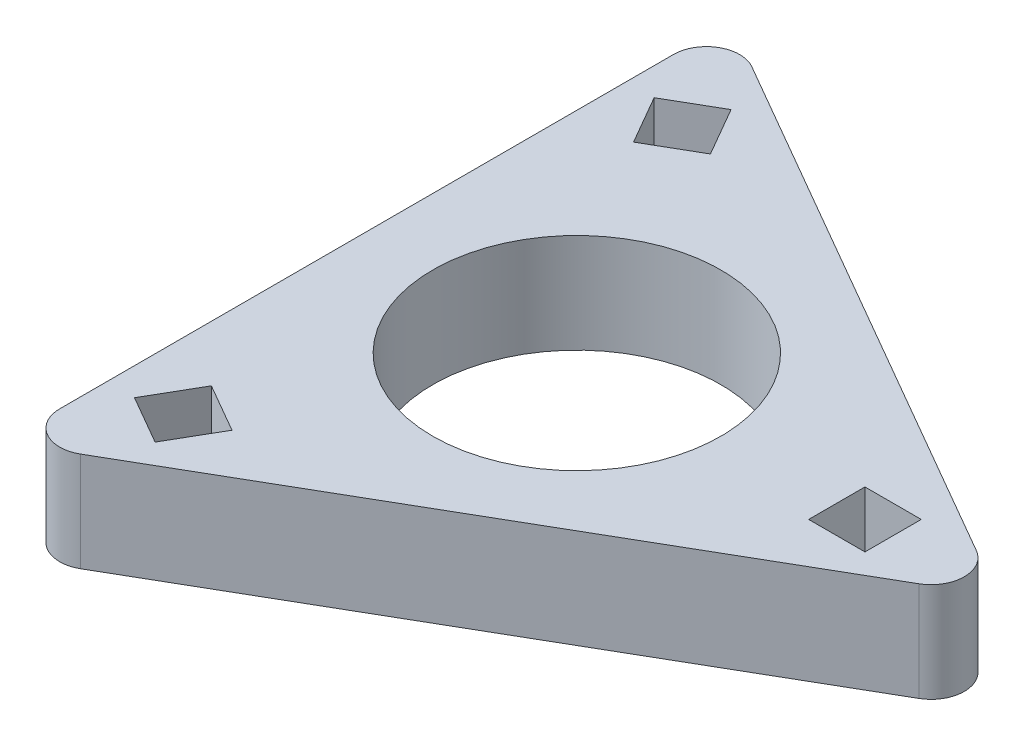
ISO-10303-21;
HEADER;
FILE_DESCRIPTION(('STEP AP214'),'2;1');
FILE_NAME('part.step','',(''),(''),'','','');
FILE_SCHEMA(('AUTOMOTIVE_DESIGN { 1 0 10303 214 1 1 1 1 }'));
ENDSEC;
DATA;
#1=APPLICATION_CONTEXT('core data for automotive mechanical design processes');
#2=APPLICATION_PROTOCOL_DEFINITION('international standard','automotive_design',2000,#1);
#3=PRODUCT_CONTEXT('',#1,'mechanical');
#4=PRODUCT('Part','Part','',(#3));
#5=PRODUCT_RELATED_PRODUCT_CATEGORY('part','',(#4));
#6=PRODUCT_DEFINITION_FORMATION('','',#4);
#7=PRODUCT_DEFINITION_CONTEXT('part definition',#1,'design');
#8=PRODUCT_DEFINITION('design','',#6,#7);
#9=PRODUCT_DEFINITION_SHAPE('','',#8);
#10=(LENGTH_UNIT() NAMED_UNIT(*) SI_UNIT(.MILLI.,.METRE.));
#11=(NAMED_UNIT(*) PLANE_ANGLE_UNIT() SI_UNIT($,.RADIAN.));
#12=(NAMED_UNIT(*) SI_UNIT($,.STERADIAN.) SOLID_ANGLE_UNIT());
#13=UNCERTAINTY_MEASURE_WITH_UNIT(LENGTH_MEASURE(1.E-05),#10,'distance_accuracy_value','');
#14=(GEOMETRIC_REPRESENTATION_CONTEXT(3) GLOBAL_UNCERTAINTY_ASSIGNED_CONTEXT((#13)) GLOBAL_UNIT_ASSIGNED_CONTEXT((#10,
#11,#12)) REPRESENTATION_CONTEXT('',''));
#15=CARTESIAN_POINT('',(0.,0.,0.));
#16=DIRECTION('',(0.,0.,1.));
#17=DIRECTION('',(1.,0.,0.));
#18=AXIS2_PLACEMENT_3D('',#15,#16,#17);
#19=CARTESIAN_POINT('',(0.,15.,0.));
#20=DIRECTION('',(0.,1.,0.));
#21=DIRECTION('',(0.,0.,1.));
#22=AXIS2_PLACEMENT_3D('',#19,#20,#21);
#23=PLANE('',#22);
#24=DIRECTION('',(-0.86602540378445,0.,-0.49999999999998));
#25=VECTOR('',#24,1.);
#26=CARTESIAN_POINT('',(184.942144258614,15.,-95.4106104839048));
#27=LINE('',#26,#25);
#28=CARTESIAN_POINT('',(177.442144258614,15.,-99.7407375028269));
#29=VERTEX_POINT('',#28);
#30=CARTESIAN_POINT('',(97.1793498423255,15.,-146.08048346498));
#31=VERTEX_POINT('',#30);
#32=EDGE_CURVE('E276',#29,#31,#27,.T.);
#33=ORIENTED_EDGE('',*,*,#32,.T.);
#34=CARTESIAN_POINT('',(94.6793498423255,15.,-141.750356446058));
#35=DIRECTION('',(0.,1.,0.));
#36=DIRECTION('',(0.,0.,1.));
#37=AXIS2_PLACEMENT_3D('',#34,#35,#36);
#38=CIRCLE('',#37,5.);
#39=CARTESIAN_POINT('',(89.6793498423255,15.,-141.750356446058));
#40=VERTEX_POINT('',#39);
#41=EDGE_CURVE('E307',#31,#40,#38,.T.);
#42=ORIENTED_EDGE('',*,*,#41,.T.);
#43=DIRECTION('',(0.,0.,1.));
#44=VECTOR('',#43,1.);
#45=CARTESIAN_POINT('',(89.6793498423255,15.,-150.410610483902));
#46=LINE('',#45,#44);
#47=CARTESIAN_POINT('',(89.6793498423264,15.,-49.0708645217476));
#48=VERTEX_POINT('',#47);
#49=EDGE_CURVE('E280',#40,#48,#46,.T.);
#50=ORIENTED_EDGE('',*,*,#49,.T.);
#51=CARTESIAN_POINT('',(94.6793498423264,15.,-49.0708645217476));
#52=DIRECTION('',(0.,1.,0.));
#53=DIRECTION('',(0.,0.,1.));
#54=AXIS2_PLACEMENT_3D('',#51,#52,#53);
#55=CIRCLE('',#54,5.);
#56=CARTESIAN_POINT('',(97.1793498423265,15.,-44.7407375028255));
#57=VERTEX_POINT('',#56);
#58=EDGE_CURVE('E59',#48,#57,#55,.T.);
#59=ORIENTED_EDGE('',*,*,#58,.T.);
#60=DIRECTION('',(0.86602540378443,0.,-0.500000000000016));
#61=VECTOR('',#60,1.);
#62=CARTESIAN_POINT('',(89.6793498423265,15.,-40.4106104839031));
#63=LINE('',#62,#61);
#64=CARTESIAN_POINT('',(177.442144258614,15.,-91.0804834649825));
#65=VERTEX_POINT('',#64);
#66=EDGE_CURVE('E274',#57,#65,#63,.T.);
#67=ORIENTED_EDGE('',*,*,#66,.T.);
#68=CARTESIAN_POINT('',(174.942144258614,15.,-95.4106104839046));
#69=DIRECTION('',(0.,1.,0.));
#70=DIRECTION('',(0.,0.,1.));
#71=AXIS2_PLACEMENT_3D('',#68,#69,#70);
#72=CIRCLE('',#71,5.);
#73=EDGE_CURVE('E305',#65,#29,#72,.T.);
#74=ORIENTED_EDGE('',*,*,#73,.T.);
#75=EDGE_LOOP('',(#33,#42,#50,#59,#67,#74));
#76=FACE_BOUND('',#75,.T.);
#77=CARTESIAN_POINT('',(121.433614647755,15.,-95.4106104839035));
#78=DIRECTION('',(0.,1.,0.));
#79=DIRECTION('',(0.,0.,1.));
#80=AXIS2_PLACEMENT_3D('',#77,#78,#79);
#81=CIRCLE('',#80,21.7542648054293);
#82=CARTESIAN_POINT('',(121.433614647755,15.,-73.6563456784742));
#83=VERTEX_POINT('',#82);
#84=EDGE_CURVE('E268',#83,#83,#81,.T.);
#85=ORIENTED_EDGE('',*,*,#84,.F.);
#86=EDGE_LOOP('',(#85));
#87=FACE_BOUND('',#86,.T.);
#88=DIRECTION('',(-0.866025403784443,0.,-0.499999999999992));
#89=VECTOR('',#88,1.);
#90=CARTESIAN_POINT('',(105.484957808406,15.,-59.2867265256794));
#91=LINE('',#90,#89);
#92=CARTESIAN_POINT('',(105.484957808406,15.,-59.2867265256794));
#93=VERTEX_POINT('',#92);
#94=CARTESIAN_POINT('',(98.1237418762381,15.,-63.5367265256793));
#95=VERTEX_POINT('',#94);
#96=EDGE_CURVE('E239',#93,#95,#91,.T.);
#97=ORIENTED_EDGE('',*,*,#96,.F.);
#98=DIRECTION('',(0.499999999999994,0.,-0.866025403784442));
#99=VECTOR('',#98,1.);
#100=CARTESIAN_POINT('',(101.234957808406,15.,-51.9255105935116));
#101=LINE('',#100,#99);
#102=CARTESIAN_POINT('',(101.234957808406,15.,-51.9255105935116));
#103=VERTEX_POINT('',#102);
#104=EDGE_CURVE('E237',#103,#93,#101,.T.);
#105=ORIENTED_EDGE('',*,*,#104,.F.);
#106=DIRECTION('',(0.866025403784443,0.,0.499999999999993));
#107=VECTOR('',#106,1.);
#108=CARTESIAN_POINT('',(93.8737418762381,15.,-56.1755105935115));
#109=LINE('',#108,#107);
#110=CARTESIAN_POINT('',(93.8737418762381,15.,-56.1755105935115));
#111=VERTEX_POINT('',#110);
#112=EDGE_CURVE('E245',#111,#103,#109,.T.);
#113=ORIENTED_EDGE('',*,*,#112,.F.);
#114=DIRECTION('',(-0.499999999999992,0.,0.866025403784443));
#115=VECTOR('',#114,1.);
#116=CARTESIAN_POINT('',(98.1237418762381,15.,-63.5367265256793));
#117=LINE('',#116,#115);
#118=EDGE_CURVE('E242',#95,#111,#117,.T.);
#119=ORIENTED_EDGE('',*,*,#118,.F.);
#120=EDGE_LOOP('',(#97,#105,#113,#119));
#121=FACE_BOUND('',#120,.T.);
#122=DIRECTION('',(-1.,0.,0.));
#123=VECTOR('',#122,1.);
#124=CARTESIAN_POINT('',(169.192144258612,15.,-99.6606104839158));
#125=LINE('',#124,#123);
#126=CARTESIAN_POINT('',(169.192144258612,15.,-99.6606104839158));
#127=VERTEX_POINT('',#126);
#128=CARTESIAN_POINT('',(160.692144258612,15.,-99.6606104839158));
#129=VERTEX_POINT('',#128);
#130=EDGE_CURVE('E208',#127,#129,#125,.T.);
#131=ORIENTED_EDGE('',*,*,#130,.F.);
#132=DIRECTION('',(0.,0.,-1.));
#133=VECTOR('',#132,1.);
#134=CARTESIAN_POINT('',(169.192144258613,15.,-91.1606104839167));
#135=LINE('',#134,#133);
#136=CARTESIAN_POINT('',(169.192144258613,15.,-91.1606104839167));
#137=VERTEX_POINT('',#136);
#138=EDGE_CURVE('E206',#137,#127,#135,.T.);
#139=ORIENTED_EDGE('',*,*,#138,.F.);
#140=DIRECTION('',(1.,0.,0.));
#141=VECTOR('',#140,1.);
#142=CARTESIAN_POINT('',(160.692144258613,15.,-91.1606104839168));
#143=LINE('',#142,#141);
#144=CARTESIAN_POINT('',(160.692144258613,15.,-91.1606104839168));
#145=VERTEX_POINT('',#144);
#146=EDGE_CURVE('E214',#145,#137,#143,.T.);
#147=ORIENTED_EDGE('',*,*,#146,.F.);
#148=DIRECTION('',(0.,0.,1.));
#149=VECTOR('',#148,1.);
#150=CARTESIAN_POINT('',(160.692144258612,15.,-99.6606104839158));
#151=LINE('',#150,#149);
#152=EDGE_CURVE('E211',#129,#145,#151,.T.);
#153=ORIENTED_EDGE('',*,*,#152,.F.);
#154=EDGE_LOOP('',(#131,#139,#147,#153));
#155=FACE_BOUND('',#154,.T.);
#156=DIRECTION('',(-0.500000000000009,0.,-0.866025403784433));
#157=VECTOR('',#156,1.);
#158=CARTESIAN_POINT('',(105.484957808413,15.,-131.53449444213));
#159=LINE('',#158,#157);
#160=CARTESIAN_POINT('',(105.484957808413,15.,-131.53449444213));
#161=VERTEX_POINT('',#160);
#162=CARTESIAN_POINT('',(101.234957808413,15.,-138.895710374298));
#163=VERTEX_POINT('',#162);
#164=EDGE_CURVE('E175',#161,#163,#159,.T.);
#165=ORIENTED_EDGE('',*,*,#164,.F.);
#166=DIRECTION('',(0.866025403784434,0.,-0.500000000000008));
#167=VECTOR('',#166,1.);
#168=CARTESIAN_POINT('',(98.1237418762454,15.,-127.28449444213));
#169=LINE('',#168,#167);
#170=CARTESIAN_POINT('',(98.1237418762454,15.,-127.28449444213));
#171=VERTEX_POINT('',#170);
#172=EDGE_CURVE('E165',#171,#161,#169,.T.);
#173=ORIENTED_EDGE('',*,*,#172,.F.);
#174=DIRECTION('',(0.500000000000009,0.,0.866025403784433));
#175=VECTOR('',#174,1.);
#176=CARTESIAN_POINT('',(93.8737418762453,15.,-134.645710374298));
#177=LINE('',#176,#175);
#178=CARTESIAN_POINT('',(93.8737418762453,15.,-134.645710374298));
#179=VERTEX_POINT('',#178);
#180=EDGE_CURVE('E190',#179,#171,#177,.T.);
#181=ORIENTED_EDGE('',*,*,#180,.F.);
#182=DIRECTION('',(-0.866025403784434,0.,0.500000000000008));
#183=VECTOR('',#182,1.);
#184=CARTESIAN_POINT('',(101.234957808413,15.,-138.895710374298));
#185=LINE('',#184,#183);
#186=EDGE_CURVE('E188',#163,#179,#185,.T.);
#187=ORIENTED_EDGE('',*,*,#186,.F.);
#188=EDGE_LOOP('',(#165,#173,#181,#187));
#189=FACE_BOUND('',#188,.T.);
#190=ADVANCED_FACE('F39',(#76,#87,#121,#155,#189),#23,.T.);
#191=CARTESIAN_POINT('',(0.,0.,0.));
#192=DIRECTION('',(0.,1.,0.));
#193=DIRECTION('',(0.,0.,1.));
#194=AXIS2_PLACEMENT_3D('',#191,#192,#193);
#195=PLANE('',#194);
#196=DIRECTION('',(0.,0.,-1.));
#197=VECTOR('',#196,1.);
#198=CARTESIAN_POINT('',(169.192144258613,0.,-91.1606104839167));
#199=LINE('',#198,#197);
#200=CARTESIAN_POINT('',(169.192144258613,0.,-91.1606104839167));
#201=VERTEX_POINT('',#200);
#202=CARTESIAN_POINT('',(169.192144258612,0.,-99.6606104839158));
#203=VERTEX_POINT('',#202);
#204=EDGE_CURVE('E183',#201,#203,#199,.T.);
#205=ORIENTED_EDGE('',*,*,#204,.T.);
#206=DIRECTION('',(-1.,0.,0.));
#207=VECTOR('',#206,1.);
#208=CARTESIAN_POINT('',(169.192144258612,0.,-99.6606104839158));
#209=LINE('',#208,#207);
#210=CARTESIAN_POINT('',(160.692144258612,0.,-99.6606104839158));
#211=VERTEX_POINT('',#210);
#212=EDGE_CURVE('E219',#203,#211,#209,.T.);
#213=ORIENTED_EDGE('',*,*,#212,.T.);
#214=DIRECTION('',(0.,0.,1.));
#215=VECTOR('',#214,1.);
#216=CARTESIAN_POINT('',(160.692144258612,0.,-99.6606104839158));
#217=LINE('',#216,#215);
#218=CARTESIAN_POINT('',(160.692144258613,0.,-91.1606104839168));
#219=VERTEX_POINT('',#218);
#220=EDGE_CURVE('E222',#211,#219,#217,.T.);
#221=ORIENTED_EDGE('',*,*,#220,.T.);
#222=DIRECTION('',(1.,0.,0.));
#223=VECTOR('',#222,1.);
#224=CARTESIAN_POINT('',(160.692144258613,0.,-91.1606104839168));
#225=LINE('',#224,#223);
#226=EDGE_CURVE('E209',#219,#201,#225,.T.);
#227=ORIENTED_EDGE('',*,*,#226,.T.);
#228=EDGE_LOOP('',(#205,#213,#221,#227));
#229=FACE_BOUND('',#228,.T.);
#230=CARTESIAN_POINT('',(121.433614647755,0.,-95.4106104839035));
#231=DIRECTION('',(0.,1.,0.));
#232=DIRECTION('',(0.,0.,1.));
#233=AXIS2_PLACEMENT_3D('',#230,#231,#232);
#234=CIRCLE('',#233,21.7542648054293);
#235=CARTESIAN_POINT('',(121.433614647755,0.,-73.6563456784742));
#236=VERTEX_POINT('',#235);
#237=EDGE_CURVE('E267',#236,#236,#234,.T.);
#238=ORIENTED_EDGE('',*,*,#237,.T.);
#239=EDGE_LOOP('',(#238));
#240=FACE_BOUND('',#239,.T.);
#241=DIRECTION('',(0.,0.,1.));
#242=VECTOR('',#241,1.);
#243=CARTESIAN_POINT('',(89.6793498423255,0.,-150.410610483902));
#244=LINE('',#243,#242);
#245=CARTESIAN_POINT('',(89.6793498423255,0.,-141.750356446058));
#246=VERTEX_POINT('',#245);
#247=CARTESIAN_POINT('',(89.6793498423264,0.,-49.0708645217476));
#248=VERTEX_POINT('',#247);
#249=EDGE_CURVE('E277',#246,#248,#244,.T.);
#250=ORIENTED_EDGE('',*,*,#249,.F.);
#251=CARTESIAN_POINT('',(94.6793498423255,0.,-141.750356446058));
#252=DIRECTION('',(0.,1.,0.));
#253=DIRECTION('',(0.,0.,1.));
#254=AXIS2_PLACEMENT_3D('',#251,#252,#253);
#255=CIRCLE('',#254,5.);
#256=CARTESIAN_POINT('',(97.1793498423255,0.,-146.08048346498));
#257=VERTEX_POINT('',#256);
#258=EDGE_CURVE('E297',#246,#257,#255,.F.);
#259=ORIENTED_EDGE('',*,*,#258,.T.);
#260=DIRECTION('',(-0.86602540378445,0.,-0.49999999999998));
#261=VECTOR('',#260,1.);
#262=CARTESIAN_POINT('',(184.942144258614,0.,-95.4106104839048));
#263=LINE('',#262,#261);
#264=CARTESIAN_POINT('',(177.442144258614,0.,-99.7407375028269));
#265=VERTEX_POINT('',#264);
#266=EDGE_CURVE('E284',#265,#257,#263,.T.);
#267=ORIENTED_EDGE('',*,*,#266,.F.);
#268=CARTESIAN_POINT('',(174.942144258614,0.,-95.4106104839046));
#269=DIRECTION('',(0.,1.,0.));
#270=DIRECTION('',(0.,0.,1.));
#271=AXIS2_PLACEMENT_3D('',#268,#269,#270);
#272=CIRCLE('',#271,5.);
#273=CARTESIAN_POINT('',(177.442144258614,0.,-91.0804834649825));
#274=VERTEX_POINT('',#273);
#275=EDGE_CURVE('E295',#265,#274,#272,.F.);
#276=ORIENTED_EDGE('',*,*,#275,.T.);
#277=DIRECTION('',(0.86602540378443,0.,-0.500000000000016));
#278=VECTOR('',#277,1.);
#279=CARTESIAN_POINT('',(89.6793498423265,0.,-40.4106104839031));
#280=LINE('',#279,#278);
#281=CARTESIAN_POINT('',(97.1793498423265,0.,-44.7407375028255));
#282=VERTEX_POINT('',#281);
#283=EDGE_CURVE('E271',#282,#274,#280,.T.);
#284=ORIENTED_EDGE('',*,*,#283,.F.);
#285=CARTESIAN_POINT('',(94.6793498423264,0.,-49.0708645217476));
#286=DIRECTION('',(0.,1.,0.));
#287=DIRECTION('',(0.,0.,1.));
#288=AXIS2_PLACEMENT_3D('',#285,#286,#287);
#289=CIRCLE('',#288,5.);
#290=EDGE_CURVE('E293',#282,#248,#289,.F.);
#291=ORIENTED_EDGE('',*,*,#290,.T.);
#292=EDGE_LOOP('',(#250,#259,#267,#276,#284,#291));
#293=FACE_BOUND('',#292,.T.);
#294=DIRECTION('',(0.499999999999994,0.,-0.866025403784442));
#295=VECTOR('',#294,1.);
#296=CARTESIAN_POINT('',(101.234957808406,0.,-51.9255105935116));
#297=LINE('',#296,#295);
#298=CARTESIAN_POINT('',(101.234957808406,0.,-51.9255105935116));
#299=VERTEX_POINT('',#298);
#300=CARTESIAN_POINT('',(105.484957808406,0.,-59.2867265256794));
#301=VERTEX_POINT('',#300);
#302=EDGE_CURVE('E236',#299,#301,#297,.T.);
#303=ORIENTED_EDGE('',*,*,#302,.T.);
#304=DIRECTION('',(-0.866025403784443,0.,-0.499999999999992));
#305=VECTOR('',#304,1.);
#306=CARTESIAN_POINT('',(105.484957808406,0.,-59.2867265256794));
#307=LINE('',#306,#305);
#308=CARTESIAN_POINT('',(98.1237418762381,0.,-63.5367265256793));
#309=VERTEX_POINT('',#308);
#310=EDGE_CURVE('E250',#301,#309,#307,.T.);
#311=ORIENTED_EDGE('',*,*,#310,.T.);
#312=DIRECTION('',(-0.499999999999992,0.,0.866025403784443));
#313=VECTOR('',#312,1.);
#314=CARTESIAN_POINT('',(98.1237418762381,0.,-63.5367265256793));
#315=LINE('',#314,#313);
#316=CARTESIAN_POINT('',(93.8737418762381,0.,-56.1755105935115));
#317=VERTEX_POINT('',#316);
#318=EDGE_CURVE('E253',#309,#317,#315,.T.);
#319=ORIENTED_EDGE('',*,*,#318,.T.);
#320=DIRECTION('',(0.866025403784443,0.,0.499999999999993));
#321=VECTOR('',#320,1.);
#322=CARTESIAN_POINT('',(93.8737418762381,0.,-56.1755105935115));
#323=LINE('',#322,#321);
#324=EDGE_CURVE('E240',#317,#299,#323,.T.);
#325=ORIENTED_EDGE('',*,*,#324,.T.);
#326=EDGE_LOOP('',(#303,#311,#319,#325));
#327=FACE_BOUND('',#326,.T.);
#328=DIRECTION('',(0.866025403784434,0.,-0.500000000000008));
#329=VECTOR('',#328,1.);
#330=CARTESIAN_POINT('',(98.1237418762454,0.,-127.28449444213));
#331=LINE('',#330,#329);
#332=CARTESIAN_POINT('',(98.1237418762454,0.,-127.28449444213));
#333=VERTEX_POINT('',#332);
#334=CARTESIAN_POINT('',(105.484957808413,0.,-131.53449444213));
#335=VERTEX_POINT('',#334);
#336=EDGE_CURVE('E194',#333,#335,#331,.T.);
#337=ORIENTED_EDGE('',*,*,#336,.T.);
#338=DIRECTION('',(-0.500000000000009,0.,-0.866025403784433));
#339=VECTOR('',#338,1.);
#340=CARTESIAN_POINT('',(105.484957808413,0.,-131.53449444213));
#341=LINE('',#340,#339);
#342=CARTESIAN_POINT('',(101.234957808413,0.,-138.895710374298));
#343=VERTEX_POINT('',#342);
#344=EDGE_CURVE('E182',#335,#343,#341,.T.);
#345=ORIENTED_EDGE('',*,*,#344,.T.);
#346=DIRECTION('',(-0.866025403784434,0.,0.500000000000008));
#347=VECTOR('',#346,1.);
#348=CARTESIAN_POINT('',(101.234957808413,0.,-138.895710374298));
#349=LINE('',#348,#347);
#350=CARTESIAN_POINT('',(93.8737418762453,0.,-134.645710374298));
#351=VERTEX_POINT('',#350);
#352=EDGE_CURVE('E197',#343,#351,#349,.T.);
#353=ORIENTED_EDGE('',*,*,#352,.T.);
#354=DIRECTION('',(0.500000000000009,0.,0.866025403784433));
#355=VECTOR('',#354,1.);
#356=CARTESIAN_POINT('',(93.8737418762453,0.,-134.645710374298));
#357=LINE('',#356,#355);
#358=EDGE_CURVE('E176',#351,#333,#357,.T.);
#359=ORIENTED_EDGE('',*,*,#358,.T.);
#360=EDGE_LOOP('',(#337,#345,#353,#359));
#361=FACE_BOUND('',#360,.T.);
#362=ADVANCED_FACE('F315',(#229,#240,#293,#327,#361),#195,.F.);
#363=CARTESIAN_POINT('',(89.6793498423265,15.,-40.4106104839031));
#364=DIRECTION('',(-0.500000000000016,0.,-0.86602540378443));
#365=DIRECTION('',(-0.86602540378443,0.,0.500000000000016));
#366=AXIS2_PLACEMENT_3D('',#363,#364,#365);
#367=PLANE('',#366);
#368=ORIENTED_EDGE('',*,*,#283,.T.);
#369=DIRECTION('',(0.,-1.,0.));
#370=VECTOR('',#369,1.);
#371=CARTESIAN_POINT('',(177.442144258614,15.,-91.0804834649825));
#372=LINE('',#371,#370);
#373=EDGE_CURVE('E11',#274,#65,#372,.F.);
#374=ORIENTED_EDGE('',*,*,#373,.T.);
#375=ORIENTED_EDGE('',*,*,#66,.F.);
#376=DIRECTION('',(0.,-1.,0.));
#377=VECTOR('',#376,1.);
#378=CARTESIAN_POINT('',(97.1793498423265,15.,-44.7407375028255));
#379=LINE('',#378,#377);
#380=EDGE_CURVE('E47',#57,#282,#379,.T.);
#381=ORIENTED_EDGE('',*,*,#380,.T.);
#382=EDGE_LOOP('',(#368,#374,#375,#381));
#383=FACE_BOUND('',#382,.T.);
#384=ADVANCED_FACE('F311',(#383),#367,.F.);
#385=CARTESIAN_POINT('',(184.942144258614,15.,-95.4106104839048));
#386=DIRECTION('',(-0.49999999999998,0.,0.86602540378445));
#387=DIRECTION('',(0.86602540378445,0.,0.49999999999998));
#388=AXIS2_PLACEMENT_3D('',#385,#386,#387);
#389=PLANE('',#388);
#390=ORIENTED_EDGE('',*,*,#266,.T.);
#391=DIRECTION('',(0.,-1.,0.));
#392=VECTOR('',#391,1.);
#393=CARTESIAN_POINT('',(97.1793498423255,15.,-146.08048346498));
#394=LINE('',#393,#392);
#395=EDGE_CURVE('E302',#257,#31,#394,.F.);
#396=ORIENTED_EDGE('',*,*,#395,.T.);
#397=ORIENTED_EDGE('',*,*,#32,.F.);
#398=DIRECTION('',(0.,-1.,0.));
#399=VECTOR('',#398,1.);
#400=CARTESIAN_POINT('',(177.442144258614,15.,-99.7407375028269));
#401=LINE('',#400,#399);
#402=EDGE_CURVE('E299',#29,#265,#401,.T.);
#403=ORIENTED_EDGE('',*,*,#402,.T.);
#404=EDGE_LOOP('',(#390,#396,#397,#403));
#405=FACE_BOUND('',#404,.T.);
#406=ADVANCED_FACE('F324',(#405),#389,.F.);
#407=CARTESIAN_POINT('',(89.6793498423255,15.,-150.410610483902));
#408=DIRECTION('',(1.,0.,0.));
#409=DIRECTION('',(0.,0.,-1.));
#410=AXIS2_PLACEMENT_3D('',#407,#408,#409);
#411=PLANE('',#410);
#412=ORIENTED_EDGE('',*,*,#49,.F.);
#413=DIRECTION('',(0.,-1.,0.));
#414=VECTOR('',#413,1.);
#415=CARTESIAN_POINT('',(89.6793498423255,15.,-141.750356446058));
#416=LINE('',#415,#414);
#417=EDGE_CURVE('E290',#40,#246,#416,.T.);
#418=ORIENTED_EDGE('',*,*,#417,.T.);
#419=ORIENTED_EDGE('',*,*,#249,.T.);
#420=DIRECTION('',(0.,-1.,0.));
#421=VECTOR('',#420,1.);
#422=CARTESIAN_POINT('',(89.6793498423264,15.,-49.0708645217476));
#423=LINE('',#422,#421);
#424=EDGE_CURVE('E282',#248,#48,#423,.F.);
#425=ORIENTED_EDGE('',*,*,#424,.T.);
#426=EDGE_LOOP('',(#412,#418,#419,#425));
#427=FACE_BOUND('',#426,.T.);
#428=ADVANCED_FACE('F333',(#427),#411,.F.);
#429=CARTESIAN_POINT('',(121.433614647755,15.,-95.4106104839035));
#430=DIRECTION('',(0.,-1.,0.));
#431=DIRECTION('',(0.,0.,-1.));
#432=AXIS2_PLACEMENT_3D('',#429,#430,#431);
#433=CYLINDRICAL_SURFACE('',#432,21.7542648054293);
#434=ORIENTED_EDGE('',*,*,#84,.T.);
#435=EDGE_LOOP('',(#434));
#436=FACE_BOUND('',#435,.T.);
#437=ORIENTED_EDGE('',*,*,#237,.F.);
#438=EDGE_LOOP('',(#437));
#439=FACE_BOUND('',#438,.T.);
#440=ADVANCED_FACE('F347',(#436,#439),#433,.F.);
#441=CARTESIAN_POINT('',(101.234957808406,15.,-51.9255105935116));
#442=DIRECTION('',(-0.866025403784442,0.,-0.499999999999994));
#443=DIRECTION('',(-0.499999999999994,0.,0.866025403784442));
#444=AXIS2_PLACEMENT_3D('',#441,#442,#443);
#445=PLANE('',#444);
#446=ORIENTED_EDGE('',*,*,#302,.F.);
#447=DIRECTION('',(0.,-1.,0.));
#448=VECTOR('',#447,1.);
#449=CARTESIAN_POINT('',(101.234957808406,15.,-51.9255105935116));
#450=LINE('',#449,#448);
#451=EDGE_CURVE('E247',#103,#299,#450,.T.);
#452=ORIENTED_EDGE('',*,*,#451,.F.);
#453=ORIENTED_EDGE('',*,*,#104,.T.);
#454=DIRECTION('',(0.,-1.,0.));
#455=VECTOR('',#454,1.);
#456=CARTESIAN_POINT('',(105.484957808406,15.,-59.2867265256794));
#457=LINE('',#456,#455);
#458=EDGE_CURVE('E264',#93,#301,#457,.T.);
#459=ORIENTED_EDGE('',*,*,#458,.T.);
#460=EDGE_LOOP('',(#446,#452,#453,#459));
#461=FACE_BOUND('',#460,.T.);
#462=ADVANCED_FACE('F401',(#461),#445,.T.);
#463=CARTESIAN_POINT('',(105.484957808406,15.,-59.2867265256794));
#464=DIRECTION('',(-0.499999999999992,0.,0.866025403784443));
#465=DIRECTION('',(0.866025403784443,0.,0.499999999999992));
#466=AXIS2_PLACEMENT_3D('',#463,#464,#465);
#467=PLANE('',#466);
#468=ORIENTED_EDGE('',*,*,#310,.F.);
#469=ORIENTED_EDGE('',*,*,#458,.F.);
#470=ORIENTED_EDGE('',*,*,#96,.T.);
#471=DIRECTION('',(0.,-1.,0.));
#472=VECTOR('',#471,1.);
#473=CARTESIAN_POINT('',(98.1237418762381,15.,-63.5367265256793));
#474=LINE('',#473,#472);
#475=EDGE_CURVE('E262',#95,#309,#474,.T.);
#476=ORIENTED_EDGE('',*,*,#475,.T.);
#477=EDGE_LOOP('',(#468,#469,#470,#476));
#478=FACE_BOUND('',#477,.T.);
#479=ADVANCED_FACE('F398',(#478),#467,.T.);
#480=CARTESIAN_POINT('',(98.1237418762381,15.,-63.5367265256793));
#481=DIRECTION('',(0.866025403784443,0.,0.499999999999992));
#482=DIRECTION('',(0.499999999999992,0.,-0.866025403784443));
#483=AXIS2_PLACEMENT_3D('',#480,#481,#482);
#484=PLANE('',#483);
#485=ORIENTED_EDGE('',*,*,#318,.F.);
#486=ORIENTED_EDGE('',*,*,#475,.F.);
#487=ORIENTED_EDGE('',*,*,#118,.T.);
#488=DIRECTION('',(0.,-1.,0.));
#489=VECTOR('',#488,1.);
#490=CARTESIAN_POINT('',(93.8737418762381,15.,-56.1755105935115));
#491=LINE('',#490,#489);
#492=EDGE_CURVE('E260',#111,#317,#491,.T.);
#493=ORIENTED_EDGE('',*,*,#492,.T.);
#494=EDGE_LOOP('',(#485,#486,#487,#493));
#495=FACE_BOUND('',#494,.T.);
#496=ADVANCED_FACE('F394',(#495),#484,.T.);
#497=CARTESIAN_POINT('',(93.8737418762381,15.,-56.1755105935115));
#498=DIRECTION('',(0.499999999999992,0.,-0.866025403784443));
#499=DIRECTION('',(-0.866025403784443,0.,-0.499999999999993));
#500=AXIS2_PLACEMENT_3D('',#497,#498,#499);
#501=PLANE('',#500);
#502=ORIENTED_EDGE('',*,*,#324,.F.);
#503=ORIENTED_EDGE('',*,*,#492,.F.);
#504=ORIENTED_EDGE('',*,*,#112,.T.);
#505=ORIENTED_EDGE('',*,*,#451,.T.);
#506=EDGE_LOOP('',(#502,#503,#504,#505));
#507=FACE_BOUND('',#506,.T.);
#508=ADVANCED_FACE('F390',(#507),#501,.T.);
#509=CARTESIAN_POINT('',(169.192144258613,15.,-91.1606104839167));
#510=DIRECTION('',(-1.,0.,0.));
#511=DIRECTION('',(0.,0.,1.));
#512=AXIS2_PLACEMENT_3D('',#509,#510,#511);
#513=PLANE('',#512);
#514=ORIENTED_EDGE('',*,*,#204,.F.);
#515=DIRECTION('',(0.,-1.,0.));
#516=VECTOR('',#515,1.);
#517=CARTESIAN_POINT('',(169.192144258613,15.,-91.1606104839167));
#518=LINE('',#517,#516);
#519=EDGE_CURVE('E216',#137,#201,#518,.T.);
#520=ORIENTED_EDGE('',*,*,#519,.F.);
#521=ORIENTED_EDGE('',*,*,#138,.T.);
#522=DIRECTION('',(0.,-1.,0.));
#523=VECTOR('',#522,1.);
#524=CARTESIAN_POINT('',(169.192144258612,15.,-99.6606104839158));
#525=LINE('',#524,#523);
#526=EDGE_CURVE('E233',#127,#203,#525,.T.);
#527=ORIENTED_EDGE('',*,*,#526,.T.);
#528=EDGE_LOOP('',(#514,#520,#521,#527));
#529=FACE_BOUND('',#528,.T.);
#530=ADVANCED_FACE('F386',(#529),#513,.T.);
#531=CARTESIAN_POINT('',(169.192144258612,15.,-99.6606104839158));
#532=DIRECTION('',(0.,0.,1.));
#533=DIRECTION('',(1.,0.,0.));
#534=AXIS2_PLACEMENT_3D('',#531,#532,#533);
#535=PLANE('',#534);
#536=ORIENTED_EDGE('',*,*,#212,.F.);
#537=ORIENTED_EDGE('',*,*,#526,.F.);
#538=ORIENTED_EDGE('',*,*,#130,.T.);
#539=DIRECTION('',(0.,-1.,0.));
#540=VECTOR('',#539,1.);
#541=CARTESIAN_POINT('',(160.692144258612,15.,-99.6606104839158));
#542=LINE('',#541,#540);
#543=EDGE_CURVE('E231',#129,#211,#542,.T.);
#544=ORIENTED_EDGE('',*,*,#543,.T.);
#545=EDGE_LOOP('',(#536,#537,#538,#544));
#546=FACE_BOUND('',#545,.T.);
#547=ADVANCED_FACE('F382',(#546),#535,.T.);
#548=CARTESIAN_POINT('',(160.692144258612,15.,-99.6606104839158));
#549=DIRECTION('',(1.,0.,0.));
#550=DIRECTION('',(0.,0.,-1.));
#551=AXIS2_PLACEMENT_3D('',#548,#549,#550);
#552=PLANE('',#551);
#553=ORIENTED_EDGE('',*,*,#220,.F.);
#554=ORIENTED_EDGE('',*,*,#543,.F.);
#555=ORIENTED_EDGE('',*,*,#152,.T.);
#556=DIRECTION('',(0.,-1.,0.));
#557=VECTOR('',#556,1.);
#558=CARTESIAN_POINT('',(160.692144258613,15.,-91.1606104839168));
#559=LINE('',#558,#557);
#560=EDGE_CURVE('E229',#145,#219,#559,.T.);
#561=ORIENTED_EDGE('',*,*,#560,.T.);
#562=EDGE_LOOP('',(#553,#554,#555,#561));
#563=FACE_BOUND('',#562,.T.);
#564=ADVANCED_FACE('F378',(#563),#552,.T.);
#565=CARTESIAN_POINT('',(160.692144258613,15.,-91.1606104839168));
#566=DIRECTION('',(0.,0.,-1.));
#567=DIRECTION('',(-1.,0.,0.));
#568=AXIS2_PLACEMENT_3D('',#565,#566,#567);
#569=PLANE('',#568);
#570=ORIENTED_EDGE('',*,*,#226,.F.);
#571=ORIENTED_EDGE('',*,*,#560,.F.);
#572=ORIENTED_EDGE('',*,*,#146,.T.);
#573=ORIENTED_EDGE('',*,*,#519,.T.);
#574=EDGE_LOOP('',(#570,#571,#572,#573));
#575=FACE_BOUND('',#574,.T.);
#576=ADVANCED_FACE('F375',(#575),#569,.T.);
#577=CARTESIAN_POINT('',(98.1237418762454,15.,-127.28449444213));
#578=DIRECTION('',(-0.500000000000008,0.,-0.866025403784434));
#579=DIRECTION('',(-0.866025403784434,0.,0.500000000000008));
#580=AXIS2_PLACEMENT_3D('',#577,#578,#579);
#581=PLANE('',#580);
#582=ORIENTED_EDGE('',*,*,#336,.F.);
#583=DIRECTION('',(0.,-1.,0.));
#584=VECTOR('',#583,1.);
#585=CARTESIAN_POINT('',(98.1237418762454,15.,-127.28449444213));
#586=LINE('',#585,#584);
#587=EDGE_CURVE('E171',#171,#333,#586,.T.);
#588=ORIENTED_EDGE('',*,*,#587,.F.);
#589=ORIENTED_EDGE('',*,*,#172,.T.);
#590=DIRECTION('',(0.,-1.,0.));
#591=VECTOR('',#590,1.);
#592=CARTESIAN_POINT('',(105.484957808413,15.,-131.53449444213));
#593=LINE('',#592,#591);
#594=EDGE_CURVE('E168',#161,#335,#593,.T.);
#595=ORIENTED_EDGE('',*,*,#594,.T.);
#596=EDGE_LOOP('',(#582,#588,#589,#595));
#597=FACE_BOUND('',#596,.T.);
#598=ADVANCED_FACE('F167',(#597),#581,.T.);
#599=CARTESIAN_POINT('',(105.484957808413,15.,-131.53449444213));
#600=DIRECTION('',(-0.866025403784433,0.,0.500000000000009));
#601=DIRECTION('',(0.500000000000009,0.,0.866025403784434));
#602=AXIS2_PLACEMENT_3D('',#599,#600,#601);
#603=PLANE('',#602);
#604=ORIENTED_EDGE('',*,*,#344,.F.);
#605=ORIENTED_EDGE('',*,*,#594,.F.);
#606=ORIENTED_EDGE('',*,*,#164,.T.);
#607=DIRECTION('',(0.,-1.,0.));
#608=VECTOR('',#607,1.);
#609=CARTESIAN_POINT('',(101.234957808413,15.,-138.895710374298));
#610=LINE('',#609,#608);
#611=EDGE_CURVE('E184',#163,#343,#610,.T.);
#612=ORIENTED_EDGE('',*,*,#611,.T.);
#613=EDGE_LOOP('',(#604,#605,#606,#612));
#614=FACE_BOUND('',#613,.T.);
#615=ADVANCED_FACE('F179',(#614),#603,.T.);
#616=CARTESIAN_POINT('',(101.234957808413,15.,-138.895710374298));
#617=DIRECTION('',(0.500000000000008,0.,0.866025403784434));
#618=DIRECTION('',(0.866025403784434,0.,-0.500000000000008));
#619=AXIS2_PLACEMENT_3D('',#616,#617,#618);
#620=PLANE('',#619);
#621=ORIENTED_EDGE('',*,*,#352,.F.);
#622=ORIENTED_EDGE('',*,*,#611,.F.);
#623=ORIENTED_EDGE('',*,*,#186,.T.);
#624=DIRECTION('',(0.,-1.,0.));
#625=VECTOR('',#624,1.);
#626=CARTESIAN_POINT('',(93.8737418762453,15.,-134.645710374298));
#627=LINE('',#626,#625);
#628=EDGE_CURVE('E203',#179,#351,#627,.T.);
#629=ORIENTED_EDGE('',*,*,#628,.T.);
#630=EDGE_LOOP('',(#621,#622,#623,#629));
#631=FACE_BOUND('',#630,.T.);
#632=ADVANCED_FACE('F361',(#631),#620,.T.);
#633=CARTESIAN_POINT('',(93.8737418762453,15.,-134.645710374298));
#634=DIRECTION('',(0.866025403784433,0.,-0.500000000000009));
#635=DIRECTION('',(-0.500000000000009,0.,-0.866025403784434));
#636=AXIS2_PLACEMENT_3D('',#633,#634,#635);
#637=PLANE('',#636);
#638=ORIENTED_EDGE('',*,*,#358,.F.);
#639=ORIENTED_EDGE('',*,*,#628,.F.);
#640=ORIENTED_EDGE('',*,*,#180,.T.);
#641=ORIENTED_EDGE('',*,*,#587,.T.);
#642=EDGE_LOOP('',(#638,#639,#640,#641));
#643=FACE_BOUND('',#642,.T.);
#644=ADVANCED_FACE('F357',(#643),#637,.T.);
#645=CARTESIAN_POINT('',(94.6793498423255,15.,-141.750356446058));
#646=DIRECTION('',(0.,-1.,0.));
#647=DIRECTION('',(0.,0.,-1.));
#648=AXIS2_PLACEMENT_3D('',#645,#646,#647);
#649=CYLINDRICAL_SURFACE('',#648,5.);
#650=ORIENTED_EDGE('',*,*,#41,.F.);
#651=ORIENTED_EDGE('',*,*,#395,.F.);
#652=ORIENTED_EDGE('',*,*,#258,.F.);
#653=ORIENTED_EDGE('',*,*,#417,.F.);
#654=EDGE_LOOP('',(#650,#651,#652,#653));
#655=FACE_BOUND('',#654,.T.);
#656=ADVANCED_FACE('F331',(#655),#649,.T.);
#657=CARTESIAN_POINT('',(174.942144258614,15.,-95.4106104839046));
#658=DIRECTION('',(0.,-1.,0.));
#659=DIRECTION('',(0.,0.,-1.));
#660=AXIS2_PLACEMENT_3D('',#657,#658,#659);
#661=CYLINDRICAL_SURFACE('',#660,5.);
#662=ORIENTED_EDGE('',*,*,#73,.F.);
#663=ORIENTED_EDGE('',*,*,#373,.F.);
#664=ORIENTED_EDGE('',*,*,#275,.F.);
#665=ORIENTED_EDGE('',*,*,#402,.F.);
#666=EDGE_LOOP('',(#662,#663,#664,#665));
#667=FACE_BOUND('',#666,.T.);
#668=ADVANCED_FACE('F321',(#667),#661,.T.);
#669=CARTESIAN_POINT('',(94.6793498423264,15.,-49.0708645217476));
#670=DIRECTION('',(0.,-1.,0.));
#671=DIRECTION('',(0.,0.,-1.));
#672=AXIS2_PLACEMENT_3D('',#669,#670,#671);
#673=CYLINDRICAL_SURFACE('',#672,5.);
#674=ORIENTED_EDGE('',*,*,#58,.F.);
#675=ORIENTED_EDGE('',*,*,#424,.F.);
#676=ORIENTED_EDGE('',*,*,#290,.F.);
#677=ORIENTED_EDGE('',*,*,#380,.F.);
#678=EDGE_LOOP('',(#674,#675,#676,#677));
#679=FACE_BOUND('',#678,.T.);
#680=ADVANCED_FACE('F41',(#679),#673,.T.);
#681=CLOSED_SHELL('',(#190,#362,#384,#406,#428,#440,#462,#479,#496,#508,#530,#547,#564,#576,
#598,#615,#632,#644,#656,#668,#680));
#682=MANIFOLD_SOLID_BREP('B2',#681);
#683=ADVANCED_BREP_SHAPE_REPRESENTATION('',(#18,#682),#14);
#684=SHAPE_DEFINITION_REPRESENTATION(#9,#683);
ENDSEC;
END-ISO-10303-21;
